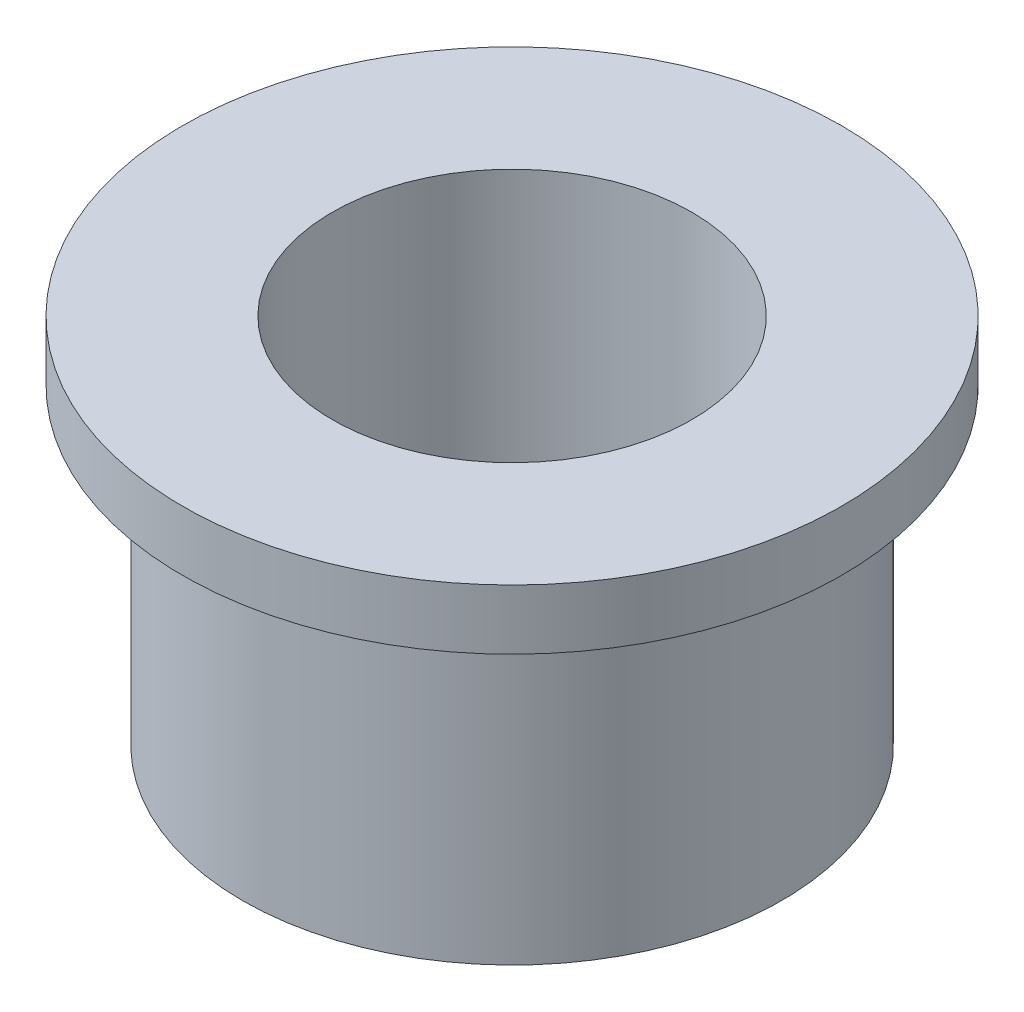
ISO-10303-21;
HEADER;
FILE_DESCRIPTION(('STEP AP214'),'2;1');
FILE_NAME('part.step','',(''),(''),'','','');
FILE_SCHEMA(('AUTOMOTIVE_DESIGN { 1 0 10303 214 1 1 1 1 }'));
ENDSEC;
DATA;
#1=APPLICATION_CONTEXT('core data for automotive mechanical design processes');
#2=APPLICATION_PROTOCOL_DEFINITION('international standard','automotive_design',2000,#1);
#3=PRODUCT_CONTEXT('',#1,'mechanical');
#4=PRODUCT('Part','Part','',(#3));
#5=PRODUCT_RELATED_PRODUCT_CATEGORY('part','',(#4));
#6=PRODUCT_DEFINITION_FORMATION('','',#4);
#7=PRODUCT_DEFINITION_CONTEXT('part definition',#1,'design');
#8=PRODUCT_DEFINITION('design','',#6,#7);
#9=PRODUCT_DEFINITION_SHAPE('','',#8);
#10=(LENGTH_UNIT() NAMED_UNIT(*) SI_UNIT(.MILLI.,.METRE.));
#11=(NAMED_UNIT(*) PLANE_ANGLE_UNIT() SI_UNIT($,.RADIAN.));
#12=(NAMED_UNIT(*) SI_UNIT($,.STERADIAN.) SOLID_ANGLE_UNIT());
#13=UNCERTAINTY_MEASURE_WITH_UNIT(LENGTH_MEASURE(1.E-05),#10,'distance_accuracy_value','');
#14=(GEOMETRIC_REPRESENTATION_CONTEXT(3) GLOBAL_UNCERTAINTY_ASSIGNED_CONTEXT((#13)) GLOBAL_UNIT_ASSIGNED_CONTEXT((#10,
#11,#12)) REPRESENTATION_CONTEXT('',''));
#15=CARTESIAN_POINT('',(0.,0.,0.));
#16=DIRECTION('',(0.,0.,1.));
#17=DIRECTION('',(1.,0.,0.));
#18=AXIS2_PLACEMENT_3D('',#15,#16,#17);
#19=CARTESIAN_POINT('',(-27.5,26.,0.));
#20=DIRECTION('',(0.,1.,0.));
#21=DIRECTION('',(0.,0.,1.));
#22=AXIS2_PLACEMENT_3D('',#19,#20,#21);
#23=PLANE('',#22);
#24=CARTESIAN_POINT('',(0.,26.,0.));
#25=DIRECTION('',(0.,-1.,0.));
#26=DIRECTION('',(0.,0.,-1.));
#27=AXIS2_PLACEMENT_3D('',#24,#25,#26);
#28=CIRCLE('',#27,22.5);
#29=CARTESIAN_POINT('',(0.,26.,-22.5));
#30=VERTEX_POINT('',#29);
#31=EDGE_CURVE('E10',#30,#30,#28,.T.);
#32=ORIENTED_EDGE('',*,*,#31,.F.);
#33=EDGE_LOOP('',(#32));
#34=FACE_BOUND('',#33,.T.);
#35=CARTESIAN_POINT('',(0.,26.,0.));
#36=DIRECTION('',(0.,-1.,0.));
#37=DIRECTION('',(0.,0.,-1.));
#38=AXIS2_PLACEMENT_3D('',#35,#36,#37);
#39=CIRCLE('',#38,27.5);
#40=CARTESIAN_POINT('',(0.,26.,-27.5));
#41=VERTEX_POINT('',#40);
#42=EDGE_CURVE('E53',#41,#41,#39,.T.);
#43=ORIENTED_EDGE('',*,*,#42,.T.);
#44=EDGE_LOOP('',(#43));
#45=FACE_BOUND('',#44,.T.);
#46=ADVANCED_FACE('F31',(#34,#45),#23,.F.);
#47=CARTESIAN_POINT('',(0.,0.,0.));
#48=DIRECTION('',(0.,-1.,0.));
#49=DIRECTION('',(0.,0.,-1.));
#50=AXIS2_PLACEMENT_3D('',#47,#48,#49);
#51=CYLINDRICAL_SURFACE('',#50,22.5);
#52=CARTESIAN_POINT('',(0.,0.,0.));
#53=DIRECTION('',(0.,-1.,0.));
#54=DIRECTION('',(0.,0.,-1.));
#55=AXIS2_PLACEMENT_3D('',#52,#53,#54);
#56=CIRCLE('',#55,22.5);
#57=CARTESIAN_POINT('',(0.,0.,-22.5));
#58=VERTEX_POINT('',#57);
#59=EDGE_CURVE('E37',#58,#58,#56,.T.);
#60=ORIENTED_EDGE('',*,*,#59,.F.);
#61=EDGE_LOOP('',(#60));
#62=FACE_BOUND('',#61,.T.);
#63=ORIENTED_EDGE('',*,*,#31,.T.);
#64=EDGE_LOOP('',(#63));
#65=FACE_BOUND('',#64,.T.);
#66=ADVANCED_FACE('F78',(#62,#65),#51,.T.);
#67=CARTESIAN_POINT('',(-15.,0.,0.));
#68=DIRECTION('',(0.,1.,0.));
#69=DIRECTION('',(0.,0.,1.));
#70=AXIS2_PLACEMENT_3D('',#67,#68,#69);
#71=PLANE('',#70);
#72=CARTESIAN_POINT('',(0.,0.,0.));
#73=DIRECTION('',(0.,-1.,0.));
#74=DIRECTION('',(0.,0.,-1.));
#75=AXIS2_PLACEMENT_3D('',#72,#73,#74);
#76=CIRCLE('',#75,15.);
#77=CARTESIAN_POINT('',(0.,0.,-15.));
#78=VERTEX_POINT('',#77);
#79=EDGE_CURVE('E41',#78,#78,#76,.T.);
#80=ORIENTED_EDGE('',*,*,#79,.F.);
#81=EDGE_LOOP('',(#80));
#82=FACE_BOUND('',#81,.T.);
#83=ORIENTED_EDGE('',*,*,#59,.T.);
#84=EDGE_LOOP('',(#83));
#85=FACE_BOUND('',#84,.T.);
#86=ADVANCED_FACE('F73',(#82,#85),#71,.F.);
#87=CARTESIAN_POINT('',(0.,0.,0.));
#88=DIRECTION('',(0.,-1.,0.));
#89=DIRECTION('',(0.,0.,-1.));
#90=AXIS2_PLACEMENT_3D('',#87,#88,#89);
#91=CYLINDRICAL_SURFACE('',#90,15.);
#92=CARTESIAN_POINT('',(0.,31.,0.));
#93=DIRECTION('',(0.,-1.,0.));
#94=DIRECTION('',(0.,0.,-1.));
#95=AXIS2_PLACEMENT_3D('',#92,#93,#94);
#96=CIRCLE('',#95,15.);
#97=CARTESIAN_POINT('',(0.,31.,-15.));
#98=VERTEX_POINT('',#97);
#99=EDGE_CURVE('E45',#98,#98,#96,.T.);
#100=ORIENTED_EDGE('',*,*,#99,.F.);
#101=EDGE_LOOP('',(#100));
#102=FACE_BOUND('',#101,.T.);
#103=ORIENTED_EDGE('',*,*,#79,.T.);
#104=EDGE_LOOP('',(#103));
#105=FACE_BOUND('',#104,.T.);
#106=ADVANCED_FACE('F67',(#102,#105),#91,.F.);
#107=CARTESIAN_POINT('',(-15.,31.,0.));
#108=DIRECTION('',(0.,-1.,0.));
#109=DIRECTION('',(0.,0.,-1.));
#110=AXIS2_PLACEMENT_3D('',#107,#108,#109);
#111=PLANE('',#110);
#112=CARTESIAN_POINT('',(0.,31.,0.));
#113=DIRECTION('',(0.,-1.,0.));
#114=DIRECTION('',(0.,0.,-1.));
#115=AXIS2_PLACEMENT_3D('',#112,#113,#114);
#116=CIRCLE('',#115,27.5);
#117=CARTESIAN_POINT('',(0.,31.,-27.5));
#118=VERTEX_POINT('',#117);
#119=EDGE_CURVE('E50',#118,#118,#116,.T.);
#120=ORIENTED_EDGE('',*,*,#119,.F.);
#121=EDGE_LOOP('',(#120));
#122=FACE_BOUND('',#121,.T.);
#123=ORIENTED_EDGE('',*,*,#99,.T.);
#124=EDGE_LOOP('',(#123));
#125=FACE_BOUND('',#124,.T.);
#126=ADVANCED_FACE('F61',(#122,#125),#111,.F.);
#127=CARTESIAN_POINT('',(0.,0.,0.));
#128=DIRECTION('',(0.,-1.,0.));
#129=DIRECTION('',(0.,0.,-1.));
#130=AXIS2_PLACEMENT_3D('',#127,#128,#129);
#131=CYLINDRICAL_SURFACE('',#130,27.5);
#132=ORIENTED_EDGE('',*,*,#42,.F.);
#133=EDGE_LOOP('',(#132));
#134=FACE_BOUND('',#133,.T.);
#135=ORIENTED_EDGE('',*,*,#119,.T.);
#136=EDGE_LOOP('',(#135));
#137=FACE_BOUND('',#136,.T.);
#138=ADVANCED_FACE('F58',(#134,#137),#131,.T.);
#139=CLOSED_SHELL('',(#46,#66,#86,#106,#126,#138));
#140=MANIFOLD_SOLID_BREP('B2',#139);
#141=ADVANCED_BREP_SHAPE_REPRESENTATION('',(#18,#140),#14);
#142=SHAPE_DEFINITION_REPRESENTATION(#9,#141);
ENDSEC;
END-ISO-10303-21;
